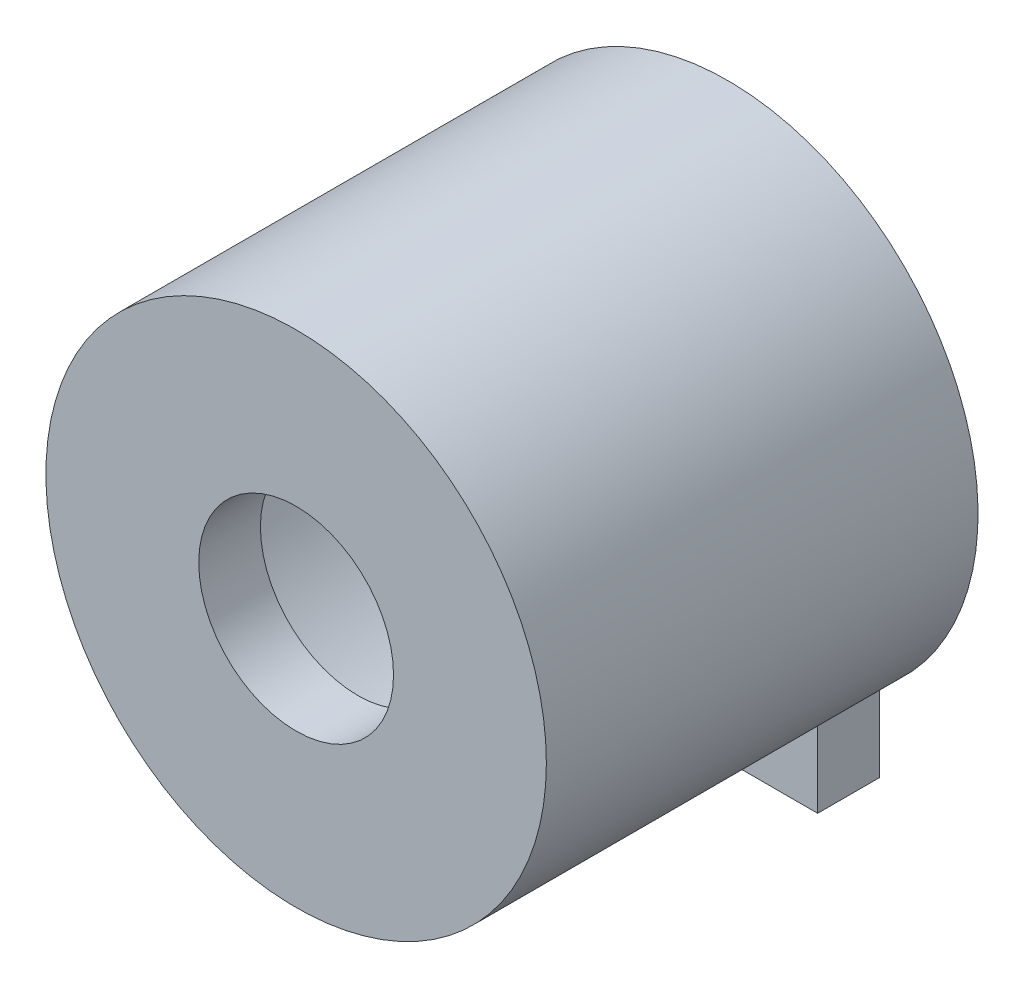
ISO-10303-21;
HEADER;
FILE_DESCRIPTION(('STEP AP214'),'2;1');
FILE_NAME('part.step','',(''),(''),'','','');
FILE_SCHEMA(('AUTOMOTIVE_DESIGN { 1 0 10303 214 1 1 1 1 }'));
ENDSEC;
DATA;
#1=APPLICATION_CONTEXT('core data for automotive mechanical design processes');
#2=APPLICATION_PROTOCOL_DEFINITION('international standard','automotive_design',2000,#1);
#3=PRODUCT_CONTEXT('',#1,'mechanical');
#4=PRODUCT('Part','Part','',(#3));
#5=PRODUCT_RELATED_PRODUCT_CATEGORY('part','',(#4));
#6=PRODUCT_DEFINITION_FORMATION('','',#4);
#7=PRODUCT_DEFINITION_CONTEXT('part definition',#1,'design');
#8=PRODUCT_DEFINITION('design','',#6,#7);
#9=PRODUCT_DEFINITION_SHAPE('','',#8);
#10=(LENGTH_UNIT() NAMED_UNIT(*) SI_UNIT(.MILLI.,.METRE.));
#11=(NAMED_UNIT(*) PLANE_ANGLE_UNIT() SI_UNIT($,.RADIAN.));
#12=(NAMED_UNIT(*) SI_UNIT($,.STERADIAN.) SOLID_ANGLE_UNIT());
#13=UNCERTAINTY_MEASURE_WITH_UNIT(LENGTH_MEASURE(1.E-05),#10,'distance_accuracy_value','');
#14=(GEOMETRIC_REPRESENTATION_CONTEXT(3) GLOBAL_UNCERTAINTY_ASSIGNED_CONTEXT((#13)) GLOBAL_UNIT_ASSIGNED_CONTEXT((#10,
#11,#12)) REPRESENTATION_CONTEXT('',''));
#15=CARTESIAN_POINT('',(0.,0.,0.));
#16=DIRECTION('',(0.,0.,1.));
#17=DIRECTION('',(1.,0.,0.));
#18=AXIS2_PLACEMENT_3D('',#15,#16,#17);
#19=CARTESIAN_POINT('',(0.,7.15,-18.));
#20=DIRECTION('',(0.,0.,-1.));
#21=DIRECTION('',(-1.,0.,0.));
#22=AXIS2_PLACEMENT_3D('',#19,#20,#21);
#23=PLANE('',#22);
#24=CARTESIAN_POINT('',(0.,7.15,-18.));
#25=DIRECTION('',(0.,0.,-1.));
#26=DIRECTION('',(-1.,0.,0.));
#27=AXIS2_PLACEMENT_3D('',#24,#25,#26);
#28=CIRCLE('',#27,10.95);
#29=CARTESIAN_POINT('',(-5.68285843399963,-2.20989423119295,-18.));
#30=VERTEX_POINT('',#29);
#31=CARTESIAN_POINT('',(4.37000153666419,-2.89019853237736,-18.));
#32=VERTEX_POINT('',#31);
#33=EDGE_CURVE('E35',#30,#32,#28,.T.);
#34=ORIENTED_EDGE('',*,*,#33,.F.);
#35=DIRECTION('',(0.,-1.,0.));
#36=VECTOR('',#35,1.);
#37=CARTESIAN_POINT('',(-5.68285843399963,0.,-18.));
#38=LINE('',#37,#36);
#39=CARTESIAN_POINT('',(-5.68285843399963,-3.61469972685524,-18.));
#40=VERTEX_POINT('',#39);
#41=EDGE_CURVE('E11',#30,#40,#38,.T.);
#42=ORIENTED_EDGE('',*,*,#41,.T.);
#43=CARTESIAN_POINT('',(0.,7.15,-18.));
#44=DIRECTION('',(0.,0.,-1.));
#45=DIRECTION('',(-1.,0.,0.));
#46=AXIS2_PLACEMENT_3D('',#43,#44,#45);
#47=CIRCLE('',#46,12.1726595364463);
#48=CARTESIAN_POINT('',(4.37000153666419,-4.21119389676061,-18.));
#49=VERTEX_POINT('',#48);
#50=EDGE_CURVE('E122',#40,#49,#47,.T.);
#51=ORIENTED_EDGE('',*,*,#50,.T.);
#52=DIRECTION('',(0.,-1.,0.));
#53=VECTOR('',#52,1.);
#54=CARTESIAN_POINT('',(4.37000153666419,0.,-18.));
#55=LINE('',#54,#53);
#56=EDGE_CURVE('E26',#32,#49,#55,.T.);
#57=ORIENTED_EDGE('',*,*,#56,.F.);
#58=EDGE_LOOP('',(#34,#42,#51,#57));
#59=FACE_BOUND('',#58,.T.);
#60=ADVANCED_FACE('F17',(#59),#23,.T.);
#61=CARTESIAN_POINT('',(0.,7.15,0.));
#62=DIRECTION('',(0.,0.,1.));
#63=DIRECTION('',(1.,0.,0.));
#64=AXIS2_PLACEMENT_3D('',#61,#62,#63);
#65=PLANE('',#64);
#66=CARTESIAN_POINT('',(0.,7.15,0.));
#67=DIRECTION('',(0.,0.,1.));
#68=DIRECTION('',(1.,0.,0.));
#69=AXIS2_PLACEMENT_3D('',#66,#67,#68);
#70=CIRCLE('',#69,4.7377777382399);
#71=CARTESIAN_POINT('',(4.7377777382399,7.15,0.));
#72=VERTEX_POINT('',#71);
#73=EDGE_CURVE('E128',#72,#72,#70,.T.);
#74=ORIENTED_EDGE('',*,*,#73,.T.);
#75=EDGE_LOOP('',(#74));
#76=FACE_BOUND('',#75,.T.);
#77=CARTESIAN_POINT('',(0.,7.15,0.));
#78=DIRECTION('',(0.,0.,-1.));
#79=DIRECTION('',(-1.,0.,0.));
#80=AXIS2_PLACEMENT_3D('',#77,#78,#79);
#81=CIRCLE('',#80,10.95);
#82=CARTESIAN_POINT('',(-10.95,7.15,0.));
#83=VERTEX_POINT('',#82);
#84=EDGE_CURVE('E82',#83,#83,#81,.T.);
#85=ORIENTED_EDGE('',*,*,#84,.T.);
#86=EDGE_LOOP('',(#85));
#87=FACE_BOUND('',#86,.T.);
#88=ADVANCED_FACE('F134',(#76,#87),#65,.F.);
#89=CARTESIAN_POINT('',(0.,7.15,3.));
#90=DIRECTION('',(0.,0.,1.));
#91=DIRECTION('',(1.,0.,0.));
#92=AXIS2_PLACEMENT_3D('',#89,#90,#91);
#93=PLANE('',#92);
#94=CARTESIAN_POINT('',(0.,7.15,3.));
#95=DIRECTION('',(0.,0.,1.));
#96=DIRECTION('',(1.,0.,0.));
#97=AXIS2_PLACEMENT_3D('',#94,#95,#96);
#98=CIRCLE('',#97,12.1726595364463);
#99=CARTESIAN_POINT('',(12.1726595364463,7.15,3.));
#100=VERTEX_POINT('',#99);
#101=EDGE_CURVE('E21',#100,#100,#98,.T.);
#102=ORIENTED_EDGE('',*,*,#101,.T.);
#103=EDGE_LOOP('',(#102));
#104=FACE_BOUND('',#103,.T.);
#105=CARTESIAN_POINT('',(0.,7.15,3.));
#106=DIRECTION('',(0.,0.,1.));
#107=DIRECTION('',(1.,0.,0.));
#108=AXIS2_PLACEMENT_3D('',#105,#106,#107);
#109=CIRCLE('',#108,4.7377777382399);
#110=CARTESIAN_POINT('',(4.7377777382399,7.15,3.));
#111=VERTEX_POINT('',#110);
#112=EDGE_CURVE('E129',#111,#111,#109,.T.);
#113=ORIENTED_EDGE('',*,*,#112,.F.);
#114=EDGE_LOOP('',(#113));
#115=FACE_BOUND('',#114,.T.);
#116=ADVANCED_FACE('F150',(#104,#115),#93,.T.);
#117=CARTESIAN_POINT('',(0.,7.15,3.));
#118=DIRECTION('',(0.,0.,-1.));
#119=DIRECTION('',(-1.,0.,0.));
#120=AXIS2_PLACEMENT_3D('',#117,#118,#119);
#121=CYLINDRICAL_SURFACE('',#120,12.1726595364463);
#122=ORIENTED_EDGE('',*,*,#101,.F.);
#123=EDGE_LOOP('',(#122));
#124=FACE_BOUND('',#123,.T.);
#125=EDGE_CURVE('E125',#49,#40,#47,.T.);
#126=ORIENTED_EDGE('',*,*,#125,.F.);
#127=ORIENTED_EDGE('',*,*,#50,.F.);
#128=EDGE_LOOP('',(#126,#127));
#129=FACE_BOUND('',#128,.T.);
#130=ADVANCED_FACE('F19',(#124,#129),#121,.T.);
#131=CARTESIAN_POINT('',(0.,7.15,3.));
#132=DIRECTION('',(0.,0.,-1.));
#133=DIRECTION('',(-1.,0.,0.));
#134=AXIS2_PLACEMENT_3D('',#131,#132,#133);
#135=CYLINDRICAL_SURFACE('',#134,4.7377777382399);
#136=ORIENTED_EDGE('',*,*,#112,.T.);
#137=EDGE_LOOP('',(#136));
#138=FACE_BOUND('',#137,.T.);
#139=ORIENTED_EDGE('',*,*,#73,.F.);
#140=EDGE_LOOP('',(#139));
#141=FACE_BOUND('',#140,.T.);
#142=ADVANCED_FACE('F137',(#138,#141),#135,.F.);
#143=CARTESIAN_POINT('',(0.,7.15,-18.));
#144=DIRECTION('',(0.,0.,1.));
#145=DIRECTION('',(1.,0.,0.));
#146=AXIS2_PLACEMENT_3D('',#143,#144,#145);
#147=CYLINDRICAL_SURFACE('',#146,10.95);
#148=EDGE_CURVE('E120',#32,#30,#28,.T.);
#149=ORIENTED_EDGE('',*,*,#148,.T.);
#150=ORIENTED_EDGE('',*,*,#33,.T.);
#151=EDGE_LOOP('',(#149,#150));
#152=FACE_BOUND('',#151,.T.);
#153=ORIENTED_EDGE('',*,*,#84,.F.);
#154=EDGE_LOOP('',(#153));
#155=FACE_BOUND('',#154,.T.);
#156=ADVANCED_FACE('F139',(#152,#155),#147,.F.);
#157=CARTESIAN_POINT('',(0.,0.,-18.));
#158=DIRECTION('',(0.,0.,-1.));
#159=DIRECTION('',(-1.,0.,0.));
#160=AXIS2_PLACEMENT_3D('',#157,#158,#159);
#161=PLANE('',#160);
#162=CARTESIAN_POINT('',(-0.656428448667719,-7.03195312790683,-18.));
#163=DIRECTION('',(0.,0.,-1.));
#164=DIRECTION('',(-1.,0.,0.));
#165=AXIS2_PLACEMENT_3D('',#162,#163,#164);
#166=CIRCLE('',#165,1.55123769047892);
#167=CARTESIAN_POINT('',(-2.20766613914664,-7.03195312790683,-18.));
#168=VERTEX_POINT('',#167);
#169=EDGE_CURVE('E103',#168,#168,#166,.T.);
#170=ORIENTED_EDGE('',*,*,#169,.T.);
#171=EDGE_LOOP('',(#170));
#172=FACE_BOUND('',#171,.T.);
#173=CARTESIAN_POINT('',(4.37000153666419,-9.36588722183274,-18.));
#174=VERTEX_POINT('',#173);
#175=EDGE_CURVE('E108',#49,#174,#55,.T.);
#176=ORIENTED_EDGE('',*,*,#175,.F.);
#177=ORIENTED_EDGE('',*,*,#125,.T.);
#178=CARTESIAN_POINT('',(-5.68285843399963,-9.36588722183274,-18.));
#179=VERTEX_POINT('',#178);
#180=EDGE_CURVE('E29',#40,#179,#38,.T.);
#181=ORIENTED_EDGE('',*,*,#180,.T.);
#182=DIRECTION('',(-1.,0.,0.));
#183=VECTOR('',#182,1.);
#184=CARTESIAN_POINT('',(0.,-9.36588722183274,-18.));
#185=LINE('',#184,#183);
#186=EDGE_CURVE('E112',#174,#179,#185,.T.);
#187=ORIENTED_EDGE('',*,*,#186,.F.);
#188=EDGE_LOOP('',(#176,#177,#181,#187));
#189=FACE_BOUND('',#188,.T.);
#190=ADVANCED_FACE('F147',(#172,#189),#161,.F.);
#191=CARTESIAN_POINT('',(-5.68285843399963,0.,-21.));
#192=DIRECTION('',(-1.,0.,0.));
#193=DIRECTION('',(0.,0.,1.));
#194=AXIS2_PLACEMENT_3D('',#191,#192,#193);
#195=PLANE('',#194);
#196=CARTESIAN_POINT('',(-5.68285843399963,-0.644007214961318,-18.));
#197=VERTEX_POINT('',#196);
#198=EDGE_CURVE('E28',#197,#30,#38,.T.);
#199=ORIENTED_EDGE('',*,*,#198,.F.);
#200=DIRECTION('',(0.,0.,1.));
#201=VECTOR('',#200,1.);
#202=CARTESIAN_POINT('',(-5.68285843399963,-0.644007214961318,-21.));
#203=LINE('',#202,#201);
#204=CARTESIAN_POINT('',(-5.68285843399963,-0.644007214961318,-21.));
#205=VERTEX_POINT('',#204);
#206=EDGE_CURVE('E71',#205,#197,#203,.T.);
#207=ORIENTED_EDGE('',*,*,#206,.F.);
#208=DIRECTION('',(0.,-1.,0.));
#209=VECTOR('',#208,1.);
#210=CARTESIAN_POINT('',(-5.68285843399963,0.,-21.));
#211=LINE('',#210,#209);
#212=CARTESIAN_POINT('',(-5.68285843399963,-9.36588722183274,-21.));
#213=VERTEX_POINT('',#212);
#214=EDGE_CURVE('E75',#205,#213,#211,.T.);
#215=ORIENTED_EDGE('',*,*,#214,.T.);
#216=DIRECTION('',(0.,0.,1.));
#217=VECTOR('',#216,1.);
#218=CARTESIAN_POINT('',(-5.68285843399963,-9.36588722183274,-21.));
#219=LINE('',#218,#217);
#220=EDGE_CURVE('E102',#213,#179,#219,.T.);
#221=ORIENTED_EDGE('',*,*,#220,.T.);
#222=ORIENTED_EDGE('',*,*,#180,.F.);
#223=ORIENTED_EDGE('',*,*,#41,.F.);
#224=EDGE_LOOP('',(#199,#207,#215,#221,#222,#223));
#225=FACE_BOUND('',#224,.T.);
#226=ADVANCED_FACE('F73',(#225),#195,.T.);
#227=CARTESIAN_POINT('',(0.,-0.644007214961318,-21.));
#228=DIRECTION('',(0.,1.,0.));
#229=DIRECTION('',(0.,0.,1.));
#230=AXIS2_PLACEMENT_3D('',#227,#228,#229);
#231=PLANE('',#230);
#232=DIRECTION('',(-1.,0.,0.));
#233=VECTOR('',#232,1.);
#234=CARTESIAN_POINT('',(0.,-0.644007214961318,-18.));
#235=LINE('',#234,#233);
#236=CARTESIAN_POINT('',(4.37000153666419,-0.644007214961318,-18.));
#237=VERTEX_POINT('',#236);
#238=EDGE_CURVE('E106',#237,#197,#235,.T.);
#239=ORIENTED_EDGE('',*,*,#238,.F.);
#240=DIRECTION('',(0.,0.,1.));
#241=VECTOR('',#240,1.);
#242=CARTESIAN_POINT('',(4.37000153666419,-0.644007214961318,-21.));
#243=LINE('',#242,#241);
#244=CARTESIAN_POINT('',(4.37000153666419,-0.644007214961318,-21.));
#245=VERTEX_POINT('',#244);
#246=EDGE_CURVE('E83',#245,#237,#243,.T.);
#247=ORIENTED_EDGE('',*,*,#246,.F.);
#248=DIRECTION('',(-1.,0.,0.));
#249=VECTOR('',#248,1.);
#250=CARTESIAN_POINT('',(0.,-0.644007214961318,-21.));
#251=LINE('',#250,#249);
#252=EDGE_CURVE('E89',#245,#205,#251,.T.);
#253=ORIENTED_EDGE('',*,*,#252,.T.);
#254=ORIENTED_EDGE('',*,*,#206,.T.);
#255=EDGE_LOOP('',(#239,#247,#253,#254));
#256=FACE_BOUND('',#255,.T.);
#257=ADVANCED_FACE('F94',(#256),#231,.T.);
#258=CARTESIAN_POINT('',(4.37000153666419,0.,-21.));
#259=DIRECTION('',(-1.,0.,0.));
#260=DIRECTION('',(0.,0.,1.));
#261=AXIS2_PLACEMENT_3D('',#258,#259,#260);
#262=PLANE('',#261);
#263=EDGE_CURVE('E109',#237,#32,#55,.T.);
#264=ORIENTED_EDGE('',*,*,#263,.T.);
#265=ORIENTED_EDGE('',*,*,#56,.T.);
#266=ORIENTED_EDGE('',*,*,#175,.T.);
#267=DIRECTION('',(0.,0.,1.));
#268=VECTOR('',#267,1.);
#269=CARTESIAN_POINT('',(4.37000153666419,-9.36588722183274,-21.));
#270=LINE('',#269,#268);
#271=CARTESIAN_POINT('',(4.37000153666419,-9.36588722183274,-21.));
#272=VERTEX_POINT('',#271);
#273=EDGE_CURVE('E116',#272,#174,#270,.T.);
#274=ORIENTED_EDGE('',*,*,#273,.F.);
#275=DIRECTION('',(0.,-1.,0.));
#276=VECTOR('',#275,1.);
#277=CARTESIAN_POINT('',(4.37000153666419,0.,-21.));
#278=LINE('',#277,#276);
#279=EDGE_CURVE('E96',#245,#272,#278,.T.);
#280=ORIENTED_EDGE('',*,*,#279,.F.);
#281=ORIENTED_EDGE('',*,*,#246,.T.);
#282=EDGE_LOOP('',(#264,#265,#266,#274,#280,#281));
#283=FACE_BOUND('',#282,.T.);
#284=ADVANCED_FACE('F163',(#283),#262,.F.);
#285=CARTESIAN_POINT('',(-0.656428448667719,-7.03195312790683,-21.));
#286=DIRECTION('',(0.,0.,1.));
#287=DIRECTION('',(1.,0.,0.));
#288=AXIS2_PLACEMENT_3D('',#285,#286,#287);
#289=CYLINDRICAL_SURFACE('',#288,1.55123769047892);
#290=CARTESIAN_POINT('',(-0.656428448667719,-7.03195312790683,-21.));
#291=DIRECTION('',(0.,0.,-1.));
#292=DIRECTION('',(-1.,0.,0.));
#293=AXIS2_PLACEMENT_3D('',#290,#291,#292);
#294=CIRCLE('',#293,1.55123769047892);
#295=CARTESIAN_POINT('',(-2.20766613914664,-7.03195312790683,-21.));
#296=VERTEX_POINT('',#295);
#297=EDGE_CURVE('E92',#296,#296,#294,.T.);
#298=ORIENTED_EDGE('',*,*,#297,.T.);
#299=EDGE_LOOP('',(#298));
#300=FACE_BOUND('',#299,.T.);
#301=ORIENTED_EDGE('',*,*,#169,.F.);
#302=EDGE_LOOP('',(#301));
#303=FACE_BOUND('',#302,.T.);
#304=ADVANCED_FACE('F159',(#300,#303),#289,.F.);
#305=CARTESIAN_POINT('',(0.,-9.36588722183274,-21.));
#306=DIRECTION('',(0.,1.,0.));
#307=DIRECTION('',(0.,0.,1.));
#308=AXIS2_PLACEMENT_3D('',#305,#306,#307);
#309=PLANE('',#308);
#310=ORIENTED_EDGE('',*,*,#186,.T.);
#311=ORIENTED_EDGE('',*,*,#220,.F.);
#312=DIRECTION('',(-1.,0.,0.));
#313=VECTOR('',#312,1.);
#314=CARTESIAN_POINT('',(0.,-9.36588722183274,-21.));
#315=LINE('',#314,#313);
#316=EDGE_CURVE('E90',#272,#213,#315,.T.);
#317=ORIENTED_EDGE('',*,*,#316,.F.);
#318=ORIENTED_EDGE('',*,*,#273,.T.);
#319=EDGE_LOOP('',(#310,#311,#317,#318));
#320=FACE_BOUND('',#319,.T.);
#321=ADVANCED_FACE('F162',(#320),#309,.F.);
#322=CARTESIAN_POINT('',(0.,0.,-21.));
#323=DIRECTION('',(0.,0.,-1.));
#324=DIRECTION('',(-1.,0.,0.));
#325=AXIS2_PLACEMENT_3D('',#322,#323,#324);
#326=PLANE('',#325);
#327=ORIENTED_EDGE('',*,*,#297,.F.);
#328=EDGE_LOOP('',(#327));
#329=FACE_BOUND('',#328,.T.);
#330=ORIENTED_EDGE('',*,*,#214,.F.);
#331=ORIENTED_EDGE('',*,*,#252,.F.);
#332=ORIENTED_EDGE('',*,*,#279,.T.);
#333=ORIENTED_EDGE('',*,*,#316,.T.);
#334=EDGE_LOOP('',(#330,#331,#332,#333));
#335=FACE_BOUND('',#334,.T.);
#336=ADVANCED_FACE('F87',(#329,#335),#326,.T.);
#337=ORIENTED_EDGE('',*,*,#148,.F.);
#338=ORIENTED_EDGE('',*,*,#263,.F.);
#339=ORIENTED_EDGE('',*,*,#238,.T.);
#340=ORIENTED_EDGE('',*,*,#198,.T.);
#341=EDGE_LOOP('',(#337,#338,#339,#340));
#342=FACE_BOUND('',#341,.T.);
#343=ADVANCED_FACE('F175',(#342),#161,.F.);
#344=CLOSED_SHELL('',(#60,#88,#116,#130,#142,#156,#190,#226,#257,#284,#304,#321,#336,#343));
#345=MANIFOLD_SOLID_BREP('B1',#344);
#346=ADVANCED_BREP_SHAPE_REPRESENTATION('',(#18,#345),#14);
#347=SHAPE_DEFINITION_REPRESENTATION(#9,#346);
ENDSEC;
END-ISO-10303-21;
